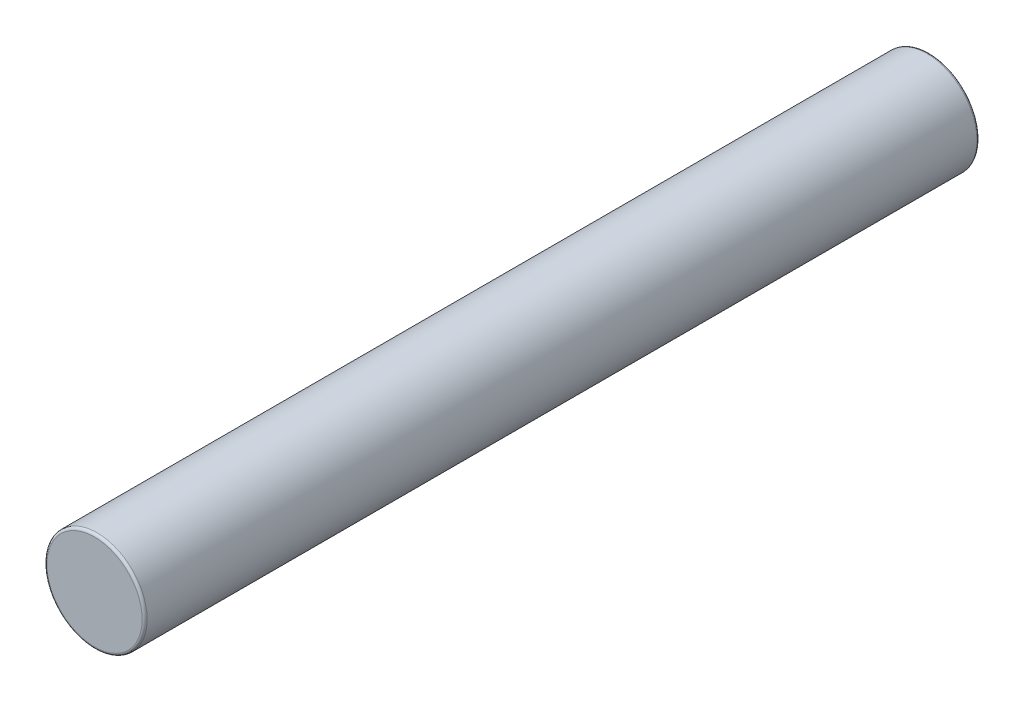
ISO-10303-21;
HEADER;
FILE_DESCRIPTION(('STEP AP214'),'2;1');
FILE_NAME('part.step','',(''),(''),'','','');
FILE_SCHEMA(('AUTOMOTIVE_DESIGN { 1 0 10303 214 1 1 1 1 }'));
ENDSEC;
DATA;
#1=APPLICATION_CONTEXT('core data for automotive mechanical design processes');
#2=APPLICATION_PROTOCOL_DEFINITION('international standard','automotive_design',2000,#1);
#3=PRODUCT_CONTEXT('',#1,'mechanical');
#4=PRODUCT('Part','Part','',(#3));
#5=PRODUCT_RELATED_PRODUCT_CATEGORY('part','',(#4));
#6=PRODUCT_DEFINITION_FORMATION('','',#4);
#7=PRODUCT_DEFINITION_CONTEXT('part definition',#1,'design');
#8=PRODUCT_DEFINITION('design','',#6,#7);
#9=PRODUCT_DEFINITION_SHAPE('','',#8);
#10=(LENGTH_UNIT() NAMED_UNIT(*) SI_UNIT(.MILLI.,.METRE.));
#11=(NAMED_UNIT(*) PLANE_ANGLE_UNIT() SI_UNIT($,.RADIAN.));
#12=(NAMED_UNIT(*) SI_UNIT($,.STERADIAN.) SOLID_ANGLE_UNIT());
#13=UNCERTAINTY_MEASURE_WITH_UNIT(LENGTH_MEASURE(1.E-05),#10,'distance_accuracy_value','');
#14=(GEOMETRIC_REPRESENTATION_CONTEXT(3) GLOBAL_UNCERTAINTY_ASSIGNED_CONTEXT((#13)) GLOBAL_UNIT_ASSIGNED_CONTEXT((#10,
#11,#12)) REPRESENTATION_CONTEXT('',''));
#15=CARTESIAN_POINT('',(0.,0.,0.));
#16=DIRECTION('',(0.,0.,1.));
#17=DIRECTION('',(1.,0.,0.));
#18=AXIS2_PLACEMENT_3D('',#15,#16,#17);
#19=CARTESIAN_POINT('',(0.,0.,-25.));
#20=DIRECTION('',(0.,0.,1.));
#21=DIRECTION('',(1.,0.,0.));
#22=AXIS2_PLACEMENT_3D('',#19,#20,#21);
#23=CYLINDRICAL_SURFACE('',#22,1.5);
#24=CARTESIAN_POINT('',(0.,0.,-24.925));
#25=DIRECTION('',(0.,0.,1.));
#26=DIRECTION('',(1.,0.,0.));
#27=AXIS2_PLACEMENT_3D('',#24,#25,#26);
#28=CIRCLE('',#27,1.5);
#29=CARTESIAN_POINT('',(1.5,0.,-24.925));
#30=VERTEX_POINT('',#29);
#31=EDGE_CURVE('E52',#30,#30,#28,.T.);
#32=ORIENTED_EDGE('',*,*,#31,.T.);
#33=EDGE_LOOP('',(#32));
#34=FACE_BOUND('',#33,.T.);
#35=CARTESIAN_POINT('',(0.,0.,-0.0749999999999987));
#36=DIRECTION('',(0.,0.,1.));
#37=DIRECTION('',(1.,0.,0.));
#38=AXIS2_PLACEMENT_3D('',#35,#36,#37);
#39=CIRCLE('',#38,1.5);
#40=CARTESIAN_POINT('',(1.5,0.,-0.0749999999999987));
#41=VERTEX_POINT('',#40);
#42=EDGE_CURVE('E56',#41,#41,#39,.F.);
#43=ORIENTED_EDGE('',*,*,#42,.T.);
#44=EDGE_LOOP('',(#43));
#45=FACE_BOUND('',#44,.T.);
#46=ADVANCED_FACE('F41',(#34,#45),#23,.T.);
#47=CARTESIAN_POINT('',(0.,0.,-25.));
#48=DIRECTION('',(0.,0.,1.));
#49=DIRECTION('',(1.,0.,0.));
#50=AXIS2_PLACEMENT_3D('',#47,#48,#49);
#51=PLANE('',#50);
#52=CARTESIAN_POINT('',(0.,0.,-25.));
#53=DIRECTION('',(0.,0.,1.));
#54=DIRECTION('',(1.,0.,0.));
#55=AXIS2_PLACEMENT_3D('',#52,#53,#54);
#56=CIRCLE('',#55,1.425);
#57=CARTESIAN_POINT('',(1.425,0.,-25.));
#58=VERTEX_POINT('',#57);
#59=EDGE_CURVE('E48',#58,#58,#56,.F.);
#60=ORIENTED_EDGE('',*,*,#59,.T.);
#61=EDGE_LOOP('',(#60));
#62=FACE_BOUND('',#61,.T.);
#63=ADVANCED_FACE('F72',(#62),#51,.F.);
#64=CARTESIAN_POINT('',(0.,0.,0.));
#65=DIRECTION('',(0.,0.,1.));
#66=DIRECTION('',(1.,0.,0.));
#67=AXIS2_PLACEMENT_3D('',#64,#65,#66);
#68=PLANE('',#67);
#69=CARTESIAN_POINT('',(0.,0.,0.));
#70=DIRECTION('',(0.,0.,1.));
#71=DIRECTION('',(1.,0.,0.));
#72=AXIS2_PLACEMENT_3D('',#69,#70,#71);
#73=CIRCLE('',#72,1.425);
#74=CARTESIAN_POINT('',(1.425,0.,0.));
#75=VERTEX_POINT('',#74);
#76=EDGE_CURVE('E10',#75,#75,#73,.T.);
#77=ORIENTED_EDGE('',*,*,#76,.T.);
#78=EDGE_LOOP('',(#77));
#79=FACE_BOUND('',#78,.T.);
#80=ADVANCED_FACE('F69',(#79),#68,.T.);
#81=CARTESIAN_POINT('',(0.,0.,-24.925));
#82=DIRECTION('',(0.,0.,1.));
#83=DIRECTION('',(1.,0.,0.));
#84=AXIS2_PLACEMENT_3D('',#81,#82,#83);
#85=TOROIDAL_SURFACE('',#84,1.425,0.075);
#86=ORIENTED_EDGE('',*,*,#59,.F.);
#87=EDGE_LOOP('',(#86));
#88=FACE_BOUND('',#87,.T.);
#89=ORIENTED_EDGE('',*,*,#31,.F.);
#90=EDGE_LOOP('',(#89));
#91=FACE_BOUND('',#90,.T.);
#92=ADVANCED_FACE('F65',(#88,#91),#85,.T.);
#93=CARTESIAN_POINT('',(0.,0.,-0.0749999999999987));
#94=DIRECTION('',(0.,0.,1.));
#95=DIRECTION('',(1.,0.,0.));
#96=AXIS2_PLACEMENT_3D('',#93,#94,#95);
#97=TOROIDAL_SURFACE('',#96,1.425,0.075);
#98=ORIENTED_EDGE('',*,*,#42,.F.);
#99=EDGE_LOOP('',(#98));
#100=FACE_BOUND('',#99,.T.);
#101=ORIENTED_EDGE('',*,*,#76,.F.);
#102=EDGE_LOOP('',(#101));
#103=FACE_BOUND('',#102,.T.);
#104=ADVANCED_FACE('F43',(#100,#103),#97,.T.);
#105=CLOSED_SHELL('',(#46,#63,#80,#92,#104));
#106=MANIFOLD_SOLID_BREP('B2',#105);
#107=ADVANCED_BREP_SHAPE_REPRESENTATION('',(#18,#106),#14);
#108=SHAPE_DEFINITION_REPRESENTATION(#9,#107);
ENDSEC;
END-ISO-10303-21;
